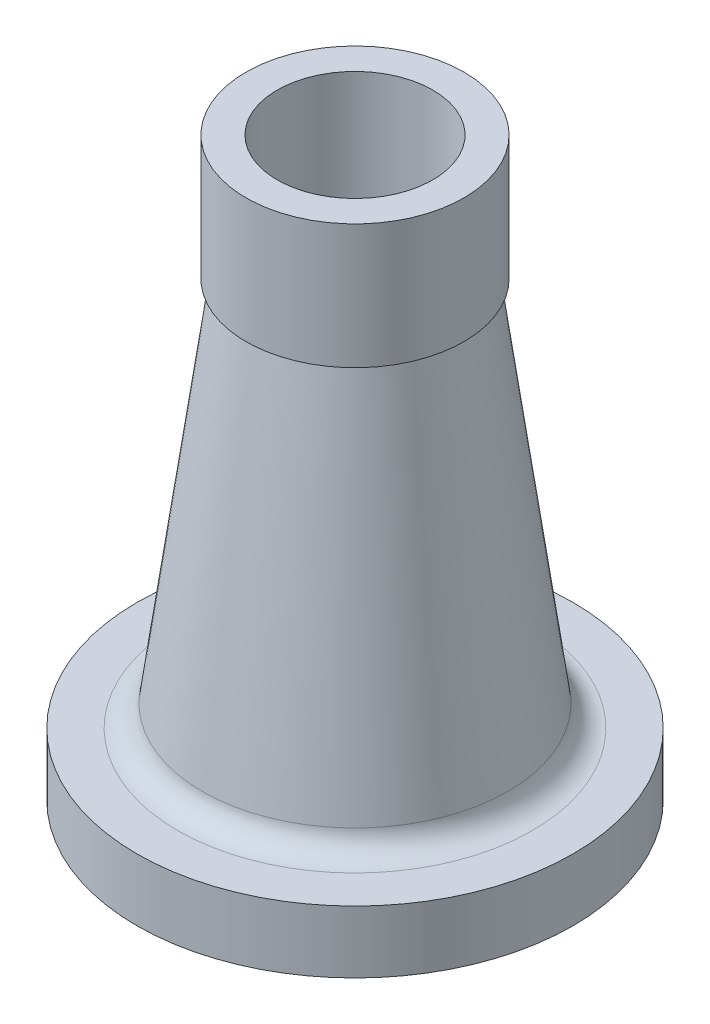
ISO-10303-21;
HEADER;
FILE_DESCRIPTION(('STEP AP214'),'2;1');
FILE_NAME('part.step','',(''),(''),'','','');
FILE_SCHEMA(('AUTOMOTIVE_DESIGN { 1 0 10303 214 1 1 1 1 }'));
ENDSEC;
DATA;
#1=APPLICATION_CONTEXT('core data for automotive mechanical design processes');
#2=APPLICATION_PROTOCOL_DEFINITION('international standard','automotive_design',2000,#1);
#3=PRODUCT_CONTEXT('',#1,'mechanical');
#4=PRODUCT('Part','Part','',(#3));
#5=PRODUCT_RELATED_PRODUCT_CATEGORY('part','',(#4));
#6=PRODUCT_DEFINITION_FORMATION('','',#4);
#7=PRODUCT_DEFINITION_CONTEXT('part definition',#1,'design');
#8=PRODUCT_DEFINITION('design','',#6,#7);
#9=PRODUCT_DEFINITION_SHAPE('','',#8);
#10=(LENGTH_UNIT() NAMED_UNIT(*) SI_UNIT(.MILLI.,.METRE.));
#11=(NAMED_UNIT(*) PLANE_ANGLE_UNIT() SI_UNIT($,.RADIAN.));
#12=(NAMED_UNIT(*) SI_UNIT($,.STERADIAN.) SOLID_ANGLE_UNIT());
#13=UNCERTAINTY_MEASURE_WITH_UNIT(LENGTH_MEASURE(1.E-05),#10,'distance_accuracy_value','');
#14=(GEOMETRIC_REPRESENTATION_CONTEXT(3) GLOBAL_UNCERTAINTY_ASSIGNED_CONTEXT((#13)) GLOBAL_UNIT_ASSIGNED_CONTEXT((#10,
#11,#12)) REPRESENTATION_CONTEXT('',''));
#15=CARTESIAN_POINT('',(0.,0.,0.));
#16=DIRECTION('',(0.,0.,1.));
#17=DIRECTION('',(1.,0.,0.));
#18=AXIS2_PLACEMENT_3D('',#15,#16,#17);
#19=CARTESIAN_POINT('',(0.,0.,0.));
#20=DIRECTION('',(0.,-1.,0.));
#21=DIRECTION('',(0.,0.,-1.));
#22=AXIS2_PLACEMENT_3D('',#19,#20,#21);
#23=CYLINDRICAL_SURFACE('',#22,50.);
#24=CARTESIAN_POINT('',(0.,0.,0.));
#25=DIRECTION('',(0.,-1.,0.));
#26=DIRECTION('',(0.,0.,-1.));
#27=AXIS2_PLACEMENT_3D('',#24,#25,#26);
#28=CIRCLE('',#27,50.);
#29=CARTESIAN_POINT('',(0.,0.,-50.));
#30=VERTEX_POINT('',#29);
#31=EDGE_CURVE('E57',#30,#30,#28,.T.);
#32=ORIENTED_EDGE('',*,*,#31,.T.);
#33=EDGE_LOOP('',(#32));
#34=FACE_BOUND('',#33,.T.);
#35=CARTESIAN_POINT('',(0.,3.,0.));
#36=DIRECTION('',(0.,-1.,0.));
#37=DIRECTION('',(0.,0.,-1.));
#38=AXIS2_PLACEMENT_3D('',#35,#36,#37);
#39=CIRCLE('',#38,50.);
#40=CARTESIAN_POINT('',(0.,3.,-50.));
#41=VERTEX_POINT('',#40);
#42=EDGE_CURVE('E81',#41,#41,#39,.T.);
#43=ORIENTED_EDGE('',*,*,#42,.F.);
#44=EDGE_LOOP('',(#43));
#45=FACE_BOUND('',#44,.T.);
#46=ADVANCED_FACE('F37',(#34,#45),#23,.F.);
#47=CARTESIAN_POINT('',(50.,0.,0.));
#48=DIRECTION('',(0.,-1.,0.));
#49=DIRECTION('',(0.,0.,-1.));
#50=AXIS2_PLACEMENT_3D('',#47,#48,#49);
#51=PLANE('',#50);
#52=CARTESIAN_POINT('',(0.,0.,0.));
#53=DIRECTION('',(0.,-1.,0.));
#54=DIRECTION('',(0.,0.,-1.));
#55=AXIS2_PLACEMENT_3D('',#52,#53,#54);
#56=CIRCLE('',#55,70.);
#57=CARTESIAN_POINT('',(0.,0.,-70.));
#58=VERTEX_POINT('',#57);
#59=EDGE_CURVE('E60',#58,#58,#56,.T.);
#60=ORIENTED_EDGE('',*,*,#59,.T.);
#61=EDGE_LOOP('',(#60));
#62=FACE_BOUND('',#61,.T.);
#63=ORIENTED_EDGE('',*,*,#31,.F.);
#64=EDGE_LOOP('',(#63));
#65=FACE_BOUND('',#64,.T.);
#66=ADVANCED_FACE('F89',(#62,#65),#51,.T.);
#67=CARTESIAN_POINT('',(0.,0.,0.));
#68=DIRECTION('',(0.,-1.,0.));
#69=DIRECTION('',(0.,0.,-1.));
#70=AXIS2_PLACEMENT_3D('',#67,#68,#69);
#71=CYLINDRICAL_SURFACE('',#70,70.);
#72=CARTESIAN_POINT('',(0.,20.,0.));
#73=DIRECTION('',(0.,-1.,0.));
#74=DIRECTION('',(0.,0.,-1.));
#75=AXIS2_PLACEMENT_3D('',#72,#73,#74);
#76=CIRCLE('',#75,70.);
#77=CARTESIAN_POINT('',(0.,20.,-70.));
#78=VERTEX_POINT('',#77);
#79=EDGE_CURVE('E63',#78,#78,#76,.T.);
#80=ORIENTED_EDGE('',*,*,#79,.T.);
#81=EDGE_LOOP('',(#80));
#82=FACE_BOUND('',#81,.T.);
#83=ORIENTED_EDGE('',*,*,#59,.F.);
#84=EDGE_LOOP('',(#83));
#85=FACE_BOUND('',#84,.T.);
#86=ADVANCED_FACE('F95',(#82,#85),#71,.T.);
#87=CARTESIAN_POINT('',(70.,20.,0.));
#88=DIRECTION('',(0.,1.,0.));
#89=DIRECTION('',(0.,0.,1.));
#90=AXIS2_PLACEMENT_3D('',#87,#88,#89);
#91=PLANE('',#90);
#92=CARTESIAN_POINT('',(0.,20.,0.));
#93=DIRECTION('',(0.,1.,0.));
#94=DIRECTION('',(0.,0.,1.));
#95=AXIS2_PLACEMENT_3D('',#92,#93,#94);
#96=CIRCLE('',#95,56.9856450256374);
#97=CARTESIAN_POINT('',(0.,20.,56.9856450256374));
#98=VERTEX_POINT('',#97);
#99=EDGE_CURVE('E52',#98,#98,#96,.F.);
#100=ORIENTED_EDGE('',*,*,#99,.T.);
#101=EDGE_LOOP('',(#100));
#102=FACE_BOUND('',#101,.T.);
#103=ORIENTED_EDGE('',*,*,#79,.F.);
#104=EDGE_LOOP('',(#103));
#105=FACE_BOUND('',#104,.T.);
#106=ADVANCED_FACE('F113',(#102,#105),#91,.T.);
#107=CARTESIAN_POINT('',(0.,20.,0.));
#108=DIRECTION('',(0.,-1.,0.));
#109=DIRECTION('',(0.,0.,-1.));
#110=AXIS2_PLACEMENT_3D('',#107,#108,#109);
#111=CONICAL_SURFACE('',#110,50.,0.135170698649009);
#112=CARTESIAN_POINT('',(0.,143.865240545436,0.));
#113=DIRECTION('',(0.,-1.,0.));
#114=DIRECTION('',(0.,0.,-1.));
#115=AXIS2_PLACEMENT_3D('',#112,#113,#114);
#116=CIRCLE('',#115,33.1543272858208);
#117=CARTESIAN_POINT('',(0.,143.865240545436,-33.1543272858208));
#118=VERTEX_POINT('',#117);
#119=EDGE_CURVE('E44',#118,#118,#116,.T.);
#120=ORIENTED_EDGE('',*,*,#119,.T.);
#121=EDGE_LOOP('',(#120));
#122=FACE_BOUND('',#121,.T.);
#123=CARTESIAN_POINT('',(0.,26.9219243634863,0.));
#124=DIRECTION('',(0.,-1.,0.));
#125=DIRECTION('',(0.,0.,-1.));
#126=AXIS2_PLACEMENT_3D('',#123,#124,#125);
#127=CIRCLE('',#126,49.0586182865659);
#128=CARTESIAN_POINT('',(0.,26.9219243634863,-49.0586182865659));
#129=VERTEX_POINT('',#128);
#130=EDGE_CURVE('E48',#129,#129,#127,.F.);
#131=ORIENTED_EDGE('',*,*,#130,.T.);
#132=EDGE_LOOP('',(#131));
#133=FACE_BOUND('',#132,.T.);
#134=ADVANCED_FACE('F116',(#122,#133),#111,.T.);
#135=CARTESIAN_POINT('',(35.,145.,0.));
#136=DIRECTION('',(0.,-1.,0.));
#137=DIRECTION('',(0.,0.,-1.));
#138=AXIS2_PLACEMENT_3D('',#135,#136,#137);
#139=PLANE('',#138);
#140=CARTESIAN_POINT('',(0.,145.,0.));
#141=DIRECTION('',(0.,-1.,0.));
#142=DIRECTION('',(0.,0.,-1.));
#143=AXIS2_PLACEMENT_3D('',#140,#141,#142);
#144=CIRCLE('',#143,34.1452056282047);
#145=CARTESIAN_POINT('',(0.,145.,-34.1452056282047));
#146=VERTEX_POINT('',#145);
#147=EDGE_CURVE('E10',#146,#146,#144,.F.);
#148=ORIENTED_EDGE('',*,*,#147,.T.);
#149=EDGE_LOOP('',(#148));
#150=FACE_BOUND('',#149,.T.);
#151=CARTESIAN_POINT('',(0.,145.,0.));
#152=DIRECTION('',(0.,-1.,0.));
#153=DIRECTION('',(0.,0.,-1.));
#154=AXIS2_PLACEMENT_3D('',#151,#152,#153);
#155=CIRCLE('',#154,35.);
#156=CARTESIAN_POINT('',(0.,145.,-35.));
#157=VERTEX_POINT('',#156);
#158=EDGE_CURVE('E66',#157,#157,#155,.T.);
#159=ORIENTED_EDGE('',*,*,#158,.T.);
#160=EDGE_LOOP('',(#159));
#161=FACE_BOUND('',#160,.T.);
#162=ADVANCED_FACE('F130',(#150,#161),#139,.T.);
#163=CARTESIAN_POINT('',(0.,0.,0.));
#164=DIRECTION('',(0.,-1.,0.));
#165=DIRECTION('',(0.,0.,-1.));
#166=AXIS2_PLACEMENT_3D('',#163,#164,#165);
#167=CYLINDRICAL_SURFACE('',#166,35.);
#168=CARTESIAN_POINT('',(0.,185.,0.));
#169=DIRECTION('',(0.,-1.,0.));
#170=DIRECTION('',(0.,0.,-1.));
#171=AXIS2_PLACEMENT_3D('',#168,#169,#170);
#172=CIRCLE('',#171,35.);
#173=CARTESIAN_POINT('',(0.,185.,-35.));
#174=VERTEX_POINT('',#173);
#175=EDGE_CURVE('E69',#174,#174,#172,.T.);
#176=ORIENTED_EDGE('',*,*,#175,.T.);
#177=EDGE_LOOP('',(#176));
#178=FACE_BOUND('',#177,.T.);
#179=ORIENTED_EDGE('',*,*,#158,.F.);
#180=EDGE_LOOP('',(#179));
#181=FACE_BOUND('',#180,.T.);
#182=ADVANCED_FACE('F133',(#178,#181),#167,.T.);
#183=CARTESIAN_POINT('',(25.,185.,0.));
#184=DIRECTION('',(0.,1.,0.));
#185=DIRECTION('',(0.,0.,1.));
#186=AXIS2_PLACEMENT_3D('',#183,#184,#185);
#187=PLANE('',#186);
#188=CARTESIAN_POINT('',(0.,185.,0.));
#189=DIRECTION('',(0.,-1.,0.));
#190=DIRECTION('',(0.,0.,-1.));
#191=AXIS2_PLACEMENT_3D('',#188,#189,#190);
#192=CIRCLE('',#191,25.);
#193=CARTESIAN_POINT('',(0.,185.,-25.));
#194=VERTEX_POINT('',#193);
#195=EDGE_CURVE('E72',#194,#194,#192,.T.);
#196=ORIENTED_EDGE('',*,*,#195,.T.);
#197=EDGE_LOOP('',(#196));
#198=FACE_BOUND('',#197,.T.);
#199=ORIENTED_EDGE('',*,*,#175,.F.);
#200=EDGE_LOOP('',(#199));
#201=FACE_BOUND('',#200,.T.);
#202=ADVANCED_FACE('F136',(#198,#201),#187,.T.);
#203=CARTESIAN_POINT('',(0.,0.,0.));
#204=DIRECTION('',(0.,-1.,0.));
#205=DIRECTION('',(0.,0.,-1.));
#206=AXIS2_PLACEMENT_3D('',#203,#204,#205);
#207=CYLINDRICAL_SURFACE('',#206,25.);
#208=CARTESIAN_POINT('',(0.,129.617233220243,0.));
#209=DIRECTION('',(0.,-1.,0.));
#210=DIRECTION('',(0.,0.,-1.));
#211=AXIS2_PLACEMENT_3D('',#208,#209,#210);
#212=CIRCLE('',#211,25.0000000000001);
#213=CARTESIAN_POINT('',(0.,129.617233220243,-25.0000000000001));
#214=VERTEX_POINT('',#213);
#215=EDGE_CURVE('E75',#214,#214,#212,.T.);
#216=ORIENTED_EDGE('',*,*,#215,.T.);
#217=EDGE_LOOP('',(#216));
#218=FACE_BOUND('',#217,.T.);
#219=ORIENTED_EDGE('',*,*,#195,.F.);
#220=EDGE_LOOP('',(#219));
#221=FACE_BOUND('',#220,.T.);
#222=ADVANCED_FACE('F140',(#218,#221),#207,.F.);
#223=CARTESIAN_POINT('',(0.,129.617233220243,0.));
#224=DIRECTION('',(0.,-1.,0.));
#225=DIRECTION('',(0.,0.,-1.));
#226=AXIS2_PLACEMENT_3D('',#223,#224,#225);
#227=CONICAL_SURFACE('',#226,25.0000000000001,0.135170698649009);
#228=CARTESIAN_POINT('',(0.,3.,0.));
#229=DIRECTION('',(0.,-1.,0.));
#230=DIRECTION('',(0.,0.,-1.));
#231=AXIS2_PLACEMENT_3D('',#228,#229,#230);
#232=CIRCLE('',#231,42.2199437179532);
#233=CARTESIAN_POINT('',(0.,3.,-42.2199437179532));
#234=VERTEX_POINT('',#233);
#235=EDGE_CURVE('E78',#234,#234,#232,.T.);
#236=ORIENTED_EDGE('',*,*,#235,.T.);
#237=EDGE_LOOP('',(#236));
#238=FACE_BOUND('',#237,.T.);
#239=ORIENTED_EDGE('',*,*,#215,.F.);
#240=EDGE_LOOP('',(#239));
#241=FACE_BOUND('',#240,.T.);
#242=ADVANCED_FACE('F107',(#238,#241),#227,.F.);
#243=CARTESIAN_POINT('',(50.,3.,0.));
#244=DIRECTION('',(0.,-1.,0.));
#245=DIRECTION('',(0.,0.,-1.));
#246=AXIS2_PLACEMENT_3D('',#243,#244,#245);
#247=PLANE('',#246);
#248=ORIENTED_EDGE('',*,*,#42,.T.);
#249=EDGE_LOOP('',(#248));
#250=FACE_BOUND('',#249,.T.);
#251=ORIENTED_EDGE('',*,*,#235,.F.);
#252=EDGE_LOOP('',(#251));
#253=FACE_BOUND('',#252,.T.);
#254=ADVANCED_FACE('F85',(#250,#253),#247,.T.);
#255=CARTESIAN_POINT('',(0.,28.,0.));
#256=DIRECTION('',(0.,1.,0.));
#257=DIRECTION('',(0.,0.,1.));
#258=AXIS2_PLACEMENT_3D('',#255,#256,#257);
#259=TOROIDAL_SURFACE('',#258,56.9856450256374,8.);
#260=ORIENTED_EDGE('',*,*,#130,.F.);
#261=EDGE_LOOP('',(#260));
#262=FACE_BOUND('',#261,.T.);
#263=ORIENTED_EDGE('',*,*,#99,.F.);
#264=EDGE_LOOP('',(#263));
#265=FACE_BOUND('',#264,.T.);
#266=ADVANCED_FACE('F99',(#262,#265),#259,.F.);
#267=CARTESIAN_POINT('',(0.,144.,0.));
#268=DIRECTION('',(0.,-1.,0.));
#269=DIRECTION('',(0.,0.,-1.));
#270=AXIS2_PLACEMENT_3D('',#267,#268,#269);
#271=TOROIDAL_SURFACE('',#270,34.1452056282047,1.);
#272=ORIENTED_EDGE('',*,*,#147,.F.);
#273=EDGE_LOOP('',(#272));
#274=FACE_BOUND('',#273,.T.);
#275=ORIENTED_EDGE('',*,*,#119,.F.);
#276=EDGE_LOOP('',(#275));
#277=FACE_BOUND('',#276,.T.);
#278=ADVANCED_FACE('F39',(#274,#277),#271,.F.);
#279=CLOSED_SHELL('',(#46,#66,#86,#106,#134,#162,#182,#202,#222,#242,#254,#266,#278));
#280=MANIFOLD_SOLID_BREP('B2',#279);
#281=ADVANCED_BREP_SHAPE_REPRESENTATION('',(#18,#280),#14);
#282=SHAPE_DEFINITION_REPRESENTATION(#9,#281);
ENDSEC;
END-ISO-10303-21;
